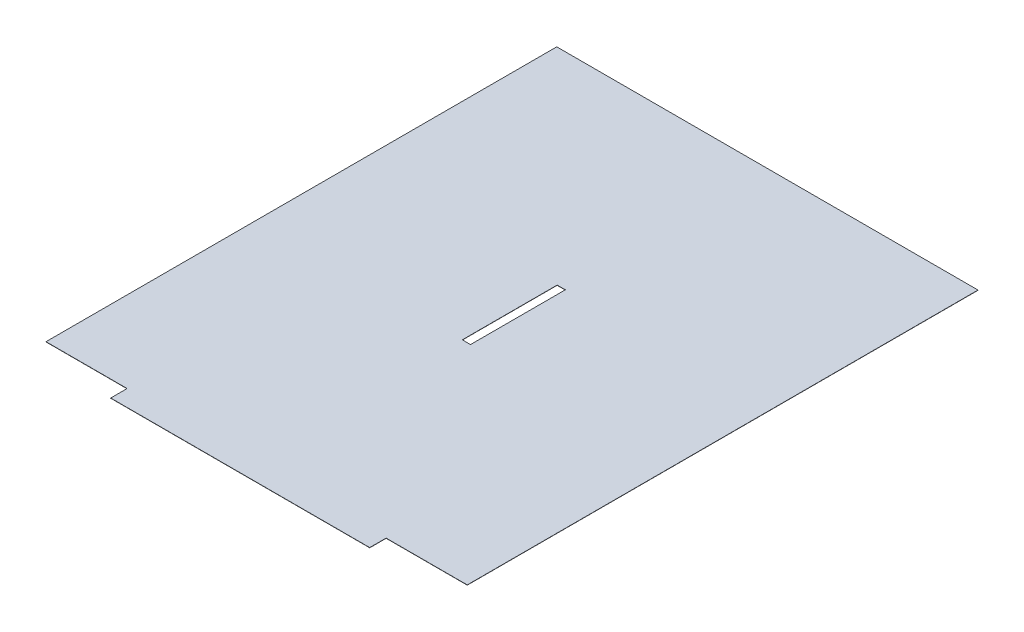
ISO-10303-21;
HEADER;
FILE_DESCRIPTION(('STEP AP214'),'2;1');
FILE_NAME('part.step','',(''),(''),'','','');
FILE_SCHEMA(('AUTOMOTIVE_DESIGN { 1 0 10303 214 1 1 1 1 }'));
ENDSEC;
DATA;
#1=APPLICATION_CONTEXT('core data for automotive mechanical design processes');
#2=APPLICATION_PROTOCOL_DEFINITION('international standard','automotive_design',2000,#1);
#3=PRODUCT_CONTEXT('',#1,'mechanical');
#4=PRODUCT('Part','Part','',(#3));
#5=PRODUCT_RELATED_PRODUCT_CATEGORY('part','',(#4));
#6=PRODUCT_DEFINITION_FORMATION('','',#4);
#7=PRODUCT_DEFINITION_CONTEXT('part definition',#1,'design');
#8=PRODUCT_DEFINITION('design','',#6,#7);
#9=PRODUCT_DEFINITION_SHAPE('','',#8);
#10=(LENGTH_UNIT() NAMED_UNIT(*) SI_UNIT(.MILLI.,.METRE.));
#11=(NAMED_UNIT(*) PLANE_ANGLE_UNIT() SI_UNIT($,.RADIAN.));
#12=(NAMED_UNIT(*) SI_UNIT($,.STERADIAN.) SOLID_ANGLE_UNIT());
#13=UNCERTAINTY_MEASURE_WITH_UNIT(LENGTH_MEASURE(1.E-05),#10,'distance_accuracy_value','');
#14=(GEOMETRIC_REPRESENTATION_CONTEXT(3) GLOBAL_UNCERTAINTY_ASSIGNED_CONTEXT((#13)) GLOBAL_UNIT_ASSIGNED_CONTEXT((#10,
#11,#12)) REPRESENTATION_CONTEXT('',''));
#15=CARTESIAN_POINT('',(0.,0.,0.));
#16=DIRECTION('',(0.,0.,1.));
#17=DIRECTION('',(1.,0.,0.));
#18=AXIS2_PLACEMENT_3D('',#15,#16,#17);
#19=CARTESIAN_POINT('',(-115.475,61.327,-139.));
#20=DIRECTION('',(0.,0.,1.));
#21=DIRECTION('',(1.,0.,0.));
#22=AXIS2_PLACEMENT_3D('',#19,#20,#21);
#23=PLANE('',#22);
#24=DIRECTION('',(-1.,0.,0.));
#25=VECTOR('',#24,1.);
#26=CARTESIAN_POINT('',(-115.475,61.2,-139.));
#27=LINE('',#26,#25);
#28=CARTESIAN_POINT('',(115.475,61.2,-139.));
#29=VERTEX_POINT('',#28);
#30=CARTESIAN_POINT('',(-115.475,61.2,-139.));
#31=VERTEX_POINT('',#30);
#32=EDGE_CURVE('E157',#29,#31,#27,.T.);
#33=ORIENTED_EDGE('',*,*,#32,.T.);
#34=DIRECTION('',(0.,-1.,0.));
#35=VECTOR('',#34,1.);
#36=CARTESIAN_POINT('',(-115.475,61.327,-139.));
#37=LINE('',#36,#35);
#38=CARTESIAN_POINT('',(-115.475,61.327,-139.));
#39=VERTEX_POINT('',#38);
#40=EDGE_CURVE('E214',#39,#31,#37,.T.);
#41=ORIENTED_EDGE('',*,*,#40,.F.);
#42=DIRECTION('',(-1.,0.,0.));
#43=VECTOR('',#42,1.);
#44=CARTESIAN_POINT('',(-115.475,61.327,-139.));
#45=LINE('',#44,#43);
#46=CARTESIAN_POINT('',(115.475,61.327,-139.));
#47=VERTEX_POINT('',#46);
#48=EDGE_CURVE('E160',#47,#39,#45,.T.);
#49=ORIENTED_EDGE('',*,*,#48,.F.);
#50=DIRECTION('',(0.,-1.,0.));
#51=VECTOR('',#50,1.);
#52=CARTESIAN_POINT('',(115.475,61.327,-139.));
#53=LINE('',#52,#51);
#54=EDGE_CURVE('E178',#47,#29,#53,.T.);
#55=ORIENTED_EDGE('',*,*,#54,.T.);
#56=EDGE_LOOP('',(#33,#41,#49,#55));
#57=FACE_BOUND('',#56,.T.);
#58=ADVANCED_FACE('F43',(#57),#23,.F.);
#59=CARTESIAN_POINT('',(-115.475,61.327,141.));
#60=DIRECTION('',(1.,0.,0.));
#61=DIRECTION('',(0.,0.,-1.));
#62=AXIS2_PLACEMENT_3D('',#59,#60,#61);
#63=PLANE('',#62);
#64=DIRECTION('',(0.,0.,1.));
#65=VECTOR('',#64,1.);
#66=CARTESIAN_POINT('',(-115.475,61.2,141.));
#67=LINE('',#66,#65);
#68=CARTESIAN_POINT('',(-115.475,61.2,141.));
#69=VERTEX_POINT('',#68);
#70=EDGE_CURVE('E181',#31,#69,#67,.T.);
#71=ORIENTED_EDGE('',*,*,#70,.T.);
#72=DIRECTION('',(0.,-1.,0.));
#73=VECTOR('',#72,1.);
#74=CARTESIAN_POINT('',(-115.475,61.327,141.));
#75=LINE('',#74,#73);
#76=CARTESIAN_POINT('',(-115.475,61.327,141.));
#77=VERTEX_POINT('',#76);
#78=EDGE_CURVE('E211',#77,#69,#75,.T.);
#79=ORIENTED_EDGE('',*,*,#78,.F.);
#80=DIRECTION('',(0.,0.,1.));
#81=VECTOR('',#80,1.);
#82=CARTESIAN_POINT('',(-115.475,61.327,141.));
#83=LINE('',#82,#81);
#84=EDGE_CURVE('E163',#39,#77,#83,.T.);
#85=ORIENTED_EDGE('',*,*,#84,.F.);
#86=ORIENTED_EDGE('',*,*,#40,.T.);
#87=EDGE_LOOP('',(#71,#79,#85,#86));
#88=FACE_BOUND('',#87,.T.);
#89=ADVANCED_FACE('F238',(#88),#63,.F.);
#90=CARTESIAN_POINT('',(-115.475,61.327,141.));
#91=DIRECTION('',(0.,0.,-1.));
#92=DIRECTION('',(-1.,0.,0.));
#93=AXIS2_PLACEMENT_3D('',#90,#91,#92);
#94=PLANE('',#93);
#95=DIRECTION('',(1.,0.,0.));
#96=VECTOR('',#95,1.);
#97=CARTESIAN_POINT('',(-115.475,61.2,141.));
#98=LINE('',#97,#96);
#99=CARTESIAN_POINT('',(-71.,61.2,141.));
#100=VERTEX_POINT('',#99);
#101=EDGE_CURVE('E183',#69,#100,#98,.T.);
#102=ORIENTED_EDGE('',*,*,#101,.T.);
#103=DIRECTION('',(0.,-1.,0.));
#104=VECTOR('',#103,1.);
#105=CARTESIAN_POINT('',(-71.,61.327,141.));
#106=LINE('',#105,#104);
#107=CARTESIAN_POINT('',(-71.,61.327,141.));
#108=VERTEX_POINT('',#107);
#109=EDGE_CURVE('E208',#108,#100,#106,.T.);
#110=ORIENTED_EDGE('',*,*,#109,.F.);
#111=DIRECTION('',(1.,0.,0.));
#112=VECTOR('',#111,1.);
#113=CARTESIAN_POINT('',(-115.475,61.327,141.));
#114=LINE('',#113,#112);
#115=EDGE_CURVE('E166',#77,#108,#114,.T.);
#116=ORIENTED_EDGE('',*,*,#115,.F.);
#117=ORIENTED_EDGE('',*,*,#78,.T.);
#118=EDGE_LOOP('',(#102,#110,#116,#117));
#119=FACE_BOUND('',#118,.T.);
#120=ADVANCED_FACE('F243',(#119),#94,.F.);
#121=CARTESIAN_POINT('',(-71.,61.327,150.));
#122=DIRECTION('',(1.,0.,0.));
#123=DIRECTION('',(0.,0.,-1.));
#124=AXIS2_PLACEMENT_3D('',#121,#122,#123);
#125=PLANE('',#124);
#126=DIRECTION('',(0.,0.,1.));
#127=VECTOR('',#126,1.);
#128=CARTESIAN_POINT('',(-71.,61.2,150.));
#129=LINE('',#128,#127);
#130=CARTESIAN_POINT('',(-71.,61.2,150.));
#131=VERTEX_POINT('',#130);
#132=EDGE_CURVE('E185',#100,#131,#129,.T.);
#133=ORIENTED_EDGE('',*,*,#132,.T.);
#134=DIRECTION('',(0.,-1.,0.));
#135=VECTOR('',#134,1.);
#136=CARTESIAN_POINT('',(-71.,61.327,150.));
#137=LINE('',#136,#135);
#138=CARTESIAN_POINT('',(-71.,61.327,150.));
#139=VERTEX_POINT('',#138);
#140=EDGE_CURVE('E205',#139,#131,#137,.T.);
#141=ORIENTED_EDGE('',*,*,#140,.F.);
#142=DIRECTION('',(0.,0.,1.));
#143=VECTOR('',#142,1.);
#144=CARTESIAN_POINT('',(-71.,61.327,150.));
#145=LINE('',#144,#143);
#146=EDGE_CURVE('E168',#108,#139,#145,.T.);
#147=ORIENTED_EDGE('',*,*,#146,.F.);
#148=ORIENTED_EDGE('',*,*,#109,.T.);
#149=EDGE_LOOP('',(#133,#141,#147,#148));
#150=FACE_BOUND('',#149,.T.);
#151=ADVANCED_FACE('F275',(#150),#125,.F.);
#152=CARTESIAN_POINT('',(-71.,61.327,150.));
#153=DIRECTION('',(0.,0.,-1.));
#154=DIRECTION('',(-1.,0.,0.));
#155=AXIS2_PLACEMENT_3D('',#152,#153,#154);
#156=PLANE('',#155);
#157=DIRECTION('',(1.,0.,0.));
#158=VECTOR('',#157,1.);
#159=CARTESIAN_POINT('',(-71.,61.2,150.));
#160=LINE('',#159,#158);
#161=CARTESIAN_POINT('',(71.,61.2,150.));
#162=VERTEX_POINT('',#161);
#163=EDGE_CURVE('E187',#131,#162,#160,.T.);
#164=ORIENTED_EDGE('',*,*,#163,.T.);
#165=DIRECTION('',(0.,-1.,0.));
#166=VECTOR('',#165,1.);
#167=CARTESIAN_POINT('',(71.,61.327,150.));
#168=LINE('',#167,#166);
#169=CARTESIAN_POINT('',(71.,61.327,150.));
#170=VERTEX_POINT('',#169);
#171=EDGE_CURVE('E202',#170,#162,#168,.T.);
#172=ORIENTED_EDGE('',*,*,#171,.F.);
#173=DIRECTION('',(1.,0.,0.));
#174=VECTOR('',#173,1.);
#175=CARTESIAN_POINT('',(-71.,61.327,150.));
#176=LINE('',#175,#174);
#177=EDGE_CURVE('E170',#139,#170,#176,.T.);
#178=ORIENTED_EDGE('',*,*,#177,.F.);
#179=ORIENTED_EDGE('',*,*,#140,.T.);
#180=EDGE_LOOP('',(#164,#172,#178,#179));
#181=FACE_BOUND('',#180,.T.);
#182=ADVANCED_FACE('F271',(#181),#156,.F.);
#183=CARTESIAN_POINT('',(71.,61.327,150.));
#184=DIRECTION('',(-1.,0.,0.));
#185=DIRECTION('',(0.,0.,1.));
#186=AXIS2_PLACEMENT_3D('',#183,#184,#185);
#187=PLANE('',#186);
#188=DIRECTION('',(0.,0.,-1.));
#189=VECTOR('',#188,1.);
#190=CARTESIAN_POINT('',(71.,61.2,150.));
#191=LINE('',#190,#189);
#192=CARTESIAN_POINT('',(71.,61.2,141.));
#193=VERTEX_POINT('',#192);
#194=EDGE_CURVE('E189',#162,#193,#191,.T.);
#195=ORIENTED_EDGE('',*,*,#194,.T.);
#196=DIRECTION('',(0.,-1.,0.));
#197=VECTOR('',#196,1.);
#198=CARTESIAN_POINT('',(71.,61.327,141.));
#199=LINE('',#198,#197);
#200=CARTESIAN_POINT('',(71.,61.327,141.));
#201=VERTEX_POINT('',#200);
#202=EDGE_CURVE('E199',#201,#193,#199,.T.);
#203=ORIENTED_EDGE('',*,*,#202,.F.);
#204=DIRECTION('',(0.,0.,-1.));
#205=VECTOR('',#204,1.);
#206=CARTESIAN_POINT('',(71.,61.327,150.));
#207=LINE('',#206,#205);
#208=EDGE_CURVE('E172',#170,#201,#207,.T.);
#209=ORIENTED_EDGE('',*,*,#208,.F.);
#210=ORIENTED_EDGE('',*,*,#171,.T.);
#211=EDGE_LOOP('',(#195,#203,#209,#210));
#212=FACE_BOUND('',#211,.T.);
#213=ADVANCED_FACE('F266',(#212),#187,.F.);
#214=CARTESIAN_POINT('',(115.475,61.327,141.));
#215=DIRECTION('',(0.,0.,-1.));
#216=DIRECTION('',(-1.,0.,0.));
#217=AXIS2_PLACEMENT_3D('',#214,#215,#216);
#218=PLANE('',#217);
#219=DIRECTION('',(1.,0.,0.));
#220=VECTOR('',#219,1.);
#221=CARTESIAN_POINT('',(115.475,61.2,141.));
#222=LINE('',#221,#220);
#223=CARTESIAN_POINT('',(115.475,61.2,141.));
#224=VERTEX_POINT('',#223);
#225=EDGE_CURVE('E191',#193,#224,#222,.T.);
#226=ORIENTED_EDGE('',*,*,#225,.T.);
#227=DIRECTION('',(0.,-1.,0.));
#228=VECTOR('',#227,1.);
#229=CARTESIAN_POINT('',(115.475,61.327,141.));
#230=LINE('',#229,#228);
#231=CARTESIAN_POINT('',(115.475,61.327,141.));
#232=VERTEX_POINT('',#231);
#233=EDGE_CURVE('E196',#232,#224,#230,.T.);
#234=ORIENTED_EDGE('',*,*,#233,.F.);
#235=DIRECTION('',(1.,0.,0.));
#236=VECTOR('',#235,1.);
#237=CARTESIAN_POINT('',(115.475,61.327,141.));
#238=LINE('',#237,#236);
#239=EDGE_CURVE('E174',#201,#232,#238,.T.);
#240=ORIENTED_EDGE('',*,*,#239,.F.);
#241=ORIENTED_EDGE('',*,*,#202,.T.);
#242=EDGE_LOOP('',(#226,#234,#240,#241));
#243=FACE_BOUND('',#242,.T.);
#244=ADVANCED_FACE('F261',(#243),#218,.F.);
#245=CARTESIAN_POINT('',(115.475,61.327,141.));
#246=DIRECTION('',(-1.,0.,0.));
#247=DIRECTION('',(0.,0.,1.));
#248=AXIS2_PLACEMENT_3D('',#245,#246,#247);
#249=PLANE('',#248);
#250=DIRECTION('',(0.,0.,-1.));
#251=VECTOR('',#250,1.);
#252=CARTESIAN_POINT('',(115.475,61.2,141.));
#253=LINE('',#252,#251);
#254=EDGE_CURVE('E164',#224,#29,#253,.T.);
#255=ORIENTED_EDGE('',*,*,#254,.T.);
#256=ORIENTED_EDGE('',*,*,#54,.F.);
#257=DIRECTION('',(0.,0.,-1.));
#258=VECTOR('',#257,1.);
#259=CARTESIAN_POINT('',(115.475,61.327,141.));
#260=LINE('',#259,#258);
#261=EDGE_CURVE('E176',#232,#47,#260,.T.);
#262=ORIENTED_EDGE('',*,*,#261,.F.);
#263=ORIENTED_EDGE('',*,*,#233,.T.);
#264=EDGE_LOOP('',(#255,#256,#262,#263));
#265=FACE_BOUND('',#264,.T.);
#266=ADVANCED_FACE('F259',(#265),#249,.F.);
#267=CARTESIAN_POINT('',(0.,61.327,0.));
#268=DIRECTION('',(0.,1.,0.));
#269=DIRECTION('',(0.,0.,1.));
#270=AXIS2_PLACEMENT_3D('',#267,#268,#269);
#271=PLANE('',#270);
#272=DIRECTION('',(0.,0.,-1.));
#273=VECTOR('',#272,1.);
#274=CARTESIAN_POINT('',(2.25,61.327,-26.));
#275=LINE('',#274,#273);
#276=CARTESIAN_POINT('',(2.25,61.327,26.));
#277=VERTEX_POINT('',#276);
#278=CARTESIAN_POINT('',(2.25,61.327,-26.));
#279=VERTEX_POINT('',#278);
#280=EDGE_CURVE('E57',#277,#279,#275,.T.);
#281=ORIENTED_EDGE('',*,*,#280,.F.);
#282=DIRECTION('',(1.,0.,0.));
#283=VECTOR('',#282,1.);
#284=CARTESIAN_POINT('',(-2.25,61.327,26.));
#285=LINE('',#284,#283);
#286=CARTESIAN_POINT('',(-2.25,61.327,26.));
#287=VERTEX_POINT('',#286);
#288=EDGE_CURVE('E150',#287,#277,#285,.T.);
#289=ORIENTED_EDGE('',*,*,#288,.F.);
#290=DIRECTION('',(0.,0.,1.));
#291=VECTOR('',#290,1.);
#292=CARTESIAN_POINT('',(-2.25,61.327,-26.));
#293=LINE('',#292,#291);
#294=CARTESIAN_POINT('',(-2.25,61.327,-26.));
#295=VERTEX_POINT('',#294);
#296=EDGE_CURVE('E134',#295,#287,#293,.T.);
#297=ORIENTED_EDGE('',*,*,#296,.F.);
#298=DIRECTION('',(-1.,0.,0.));
#299=VECTOR('',#298,1.);
#300=CARTESIAN_POINT('',(-2.25,61.327,-26.));
#301=LINE('',#300,#299);
#302=EDGE_CURVE('E143',#279,#295,#301,.T.);
#303=ORIENTED_EDGE('',*,*,#302,.F.);
#304=EDGE_LOOP('',(#281,#289,#297,#303));
#305=FACE_BOUND('',#304,.T.);
#306=ORIENTED_EDGE('',*,*,#48,.T.);
#307=ORIENTED_EDGE('',*,*,#84,.T.);
#308=ORIENTED_EDGE('',*,*,#115,.T.);
#309=ORIENTED_EDGE('',*,*,#146,.T.);
#310=ORIENTED_EDGE('',*,*,#177,.T.);
#311=ORIENTED_EDGE('',*,*,#208,.T.);
#312=ORIENTED_EDGE('',*,*,#239,.T.);
#313=ORIENTED_EDGE('',*,*,#261,.T.);
#314=EDGE_LOOP('',(#306,#307,#308,#309,#310,#311,#312,#313));
#315=FACE_BOUND('',#314,.T.);
#316=ADVANCED_FACE('F147',(#305,#315),#271,.T.);
#317=CARTESIAN_POINT('',(0.,61.2,0.));
#318=DIRECTION('',(0.,1.,0.));
#319=DIRECTION('',(0.,0.,1.));
#320=AXIS2_PLACEMENT_3D('',#317,#318,#319);
#321=PLANE('',#320);
#322=DIRECTION('',(1.,0.,0.));
#323=VECTOR('',#322,1.);
#324=CARTESIAN_POINT('',(0.,61.2,26.));
#325=LINE('',#324,#323);
#326=CARTESIAN_POINT('',(-2.25,61.2,26.));
#327=VERTEX_POINT('',#326);
#328=CARTESIAN_POINT('',(2.25,61.2,26.));
#329=VERTEX_POINT('',#328);
#330=EDGE_CURVE('E50',#327,#329,#325,.T.);
#331=ORIENTED_EDGE('',*,*,#330,.T.);
#332=DIRECTION('',(0.,0.,-1.));
#333=VECTOR('',#332,1.);
#334=CARTESIAN_POINT('',(2.25,61.2,0.));
#335=LINE('',#334,#333);
#336=CARTESIAN_POINT('',(2.25,61.2,-26.));
#337=VERTEX_POINT('',#336);
#338=EDGE_CURVE('E11',#329,#337,#335,.T.);
#339=ORIENTED_EDGE('',*,*,#338,.T.);
#340=DIRECTION('',(-1.,0.,0.));
#341=VECTOR('',#340,1.);
#342=CARTESIAN_POINT('',(0.,61.2,-26.));
#343=LINE('',#342,#341);
#344=CARTESIAN_POINT('',(-2.25,61.2,-26.));
#345=VERTEX_POINT('',#344);
#346=EDGE_CURVE('E217',#337,#345,#343,.T.);
#347=ORIENTED_EDGE('',*,*,#346,.T.);
#348=DIRECTION('',(0.,0.,1.));
#349=VECTOR('',#348,1.);
#350=CARTESIAN_POINT('',(-2.25,61.2,0.));
#351=LINE('',#350,#349);
#352=EDGE_CURVE('E137',#345,#327,#351,.T.);
#353=ORIENTED_EDGE('',*,*,#352,.T.);
#354=EDGE_LOOP('',(#331,#339,#347,#353));
#355=FACE_BOUND('',#354,.T.);
#356=ORIENTED_EDGE('',*,*,#32,.F.);
#357=ORIENTED_EDGE('',*,*,#254,.F.);
#358=ORIENTED_EDGE('',*,*,#225,.F.);
#359=ORIENTED_EDGE('',*,*,#194,.F.);
#360=ORIENTED_EDGE('',*,*,#163,.F.);
#361=ORIENTED_EDGE('',*,*,#132,.F.);
#362=ORIENTED_EDGE('',*,*,#101,.F.);
#363=ORIENTED_EDGE('',*,*,#70,.F.);
#364=EDGE_LOOP('',(#356,#357,#358,#359,#360,#361,#362,#363));
#365=FACE_BOUND('',#364,.T.);
#366=ADVANCED_FACE('F221',(#355,#365),#321,.F.);
#367=CARTESIAN_POINT('',(2.25,51.327,-26.));
#368=DIRECTION('',(1.,0.,0.));
#369=DIRECTION('',(0.,0.,-1.));
#370=AXIS2_PLACEMENT_3D('',#367,#368,#369);
#371=PLANE('',#370);
#372=DIRECTION('',(0.,1.,0.));
#373=VECTOR('',#372,1.);
#374=CARTESIAN_POINT('',(2.25,51.327,26.));
#375=LINE('',#374,#373);
#376=EDGE_CURVE('E155',#329,#277,#375,.T.);
#377=ORIENTED_EDGE('',*,*,#376,.T.);
#378=ORIENTED_EDGE('',*,*,#280,.T.);
#379=DIRECTION('',(0.,1.,0.));
#380=VECTOR('',#379,1.);
#381=CARTESIAN_POINT('',(2.25,51.327,-26.));
#382=LINE('',#381,#380);
#383=EDGE_CURVE('E140',#337,#279,#382,.T.);
#384=ORIENTED_EDGE('',*,*,#383,.F.);
#385=ORIENTED_EDGE('',*,*,#338,.F.);
#386=EDGE_LOOP('',(#377,#378,#384,#385));
#387=FACE_BOUND('',#386,.T.);
#388=ADVANCED_FACE('F226',(#387),#371,.F.);
#389=CARTESIAN_POINT('',(-2.25,51.327,26.));
#390=DIRECTION('',(0.,0.,1.));
#391=DIRECTION('',(1.,0.,0.));
#392=AXIS2_PLACEMENT_3D('',#389,#390,#391);
#393=PLANE('',#392);
#394=DIRECTION('',(0.,1.,0.));
#395=VECTOR('',#394,1.);
#396=CARTESIAN_POINT('',(-2.25,51.327,26.));
#397=LINE('',#396,#395);
#398=EDGE_CURVE('E139',#327,#287,#397,.T.);
#399=ORIENTED_EDGE('',*,*,#398,.T.);
#400=ORIENTED_EDGE('',*,*,#288,.T.);
#401=ORIENTED_EDGE('',*,*,#376,.F.);
#402=ORIENTED_EDGE('',*,*,#330,.F.);
#403=EDGE_LOOP('',(#399,#400,#401,#402));
#404=FACE_BOUND('',#403,.T.);
#405=ADVANCED_FACE('F225',(#404),#393,.F.);
#406=CARTESIAN_POINT('',(-2.25,51.327,-26.));
#407=DIRECTION('',(-1.,0.,0.));
#408=DIRECTION('',(0.,0.,1.));
#409=AXIS2_PLACEMENT_3D('',#406,#407,#408);
#410=PLANE('',#409);
#411=DIRECTION('',(0.,1.,0.));
#412=VECTOR('',#411,1.);
#413=CARTESIAN_POINT('',(-2.25,51.327,-26.));
#414=LINE('',#413,#412);
#415=EDGE_CURVE('E65',#345,#295,#414,.T.);
#416=ORIENTED_EDGE('',*,*,#415,.T.);
#417=ORIENTED_EDGE('',*,*,#296,.T.);
#418=ORIENTED_EDGE('',*,*,#398,.F.);
#419=ORIENTED_EDGE('',*,*,#352,.F.);
#420=EDGE_LOOP('',(#416,#417,#418,#419));
#421=FACE_BOUND('',#420,.T.);
#422=ADVANCED_FACE('F131',(#421),#410,.F.);
#423=CARTESIAN_POINT('',(-2.25,51.327,-26.));
#424=DIRECTION('',(0.,0.,-1.));
#425=DIRECTION('',(-1.,0.,0.));
#426=AXIS2_PLACEMENT_3D('',#423,#424,#425);
#427=PLANE('',#426);
#428=ORIENTED_EDGE('',*,*,#383,.T.);
#429=ORIENTED_EDGE('',*,*,#302,.T.);
#430=ORIENTED_EDGE('',*,*,#415,.F.);
#431=ORIENTED_EDGE('',*,*,#346,.F.);
#432=EDGE_LOOP('',(#428,#429,#430,#431));
#433=FACE_BOUND('',#432,.T.);
#434=ADVANCED_FACE('F144',(#433),#427,.F.);
#435=CLOSED_SHELL('',(#58,#89,#120,#151,#182,#213,#244,#266,#316,#366,#388,#405,#422,#434));
#436=MANIFOLD_SOLID_BREP('B2',#435);
#437=ADVANCED_BREP_SHAPE_REPRESENTATION('',(#18,#436),#14);
#438=SHAPE_DEFINITION_REPRESENTATION(#9,#437);
ENDSEC;
END-ISO-10303-21;
